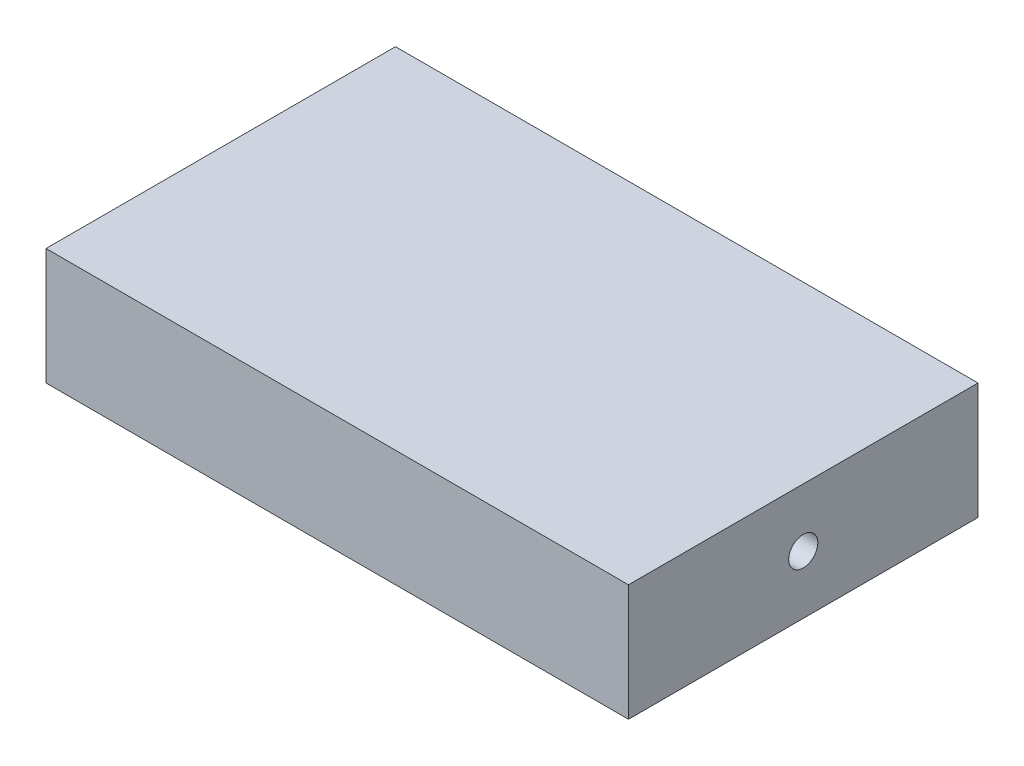
ISO-10303-21;
HEADER;
FILE_DESCRIPTION(('STEP AP214'),'2;1');
FILE_NAME('part.step','',(''),(''),'','','');
FILE_SCHEMA(('AUTOMOTIVE_DESIGN { 1 0 10303 214 1 1 1 1 }'));
ENDSEC;
DATA;
#1=APPLICATION_CONTEXT('core data for automotive mechanical design processes');
#2=APPLICATION_PROTOCOL_DEFINITION('international standard','automotive_design',2000,#1);
#3=PRODUCT_CONTEXT('',#1,'mechanical');
#4=PRODUCT('Part','Part','',(#3));
#5=PRODUCT_RELATED_PRODUCT_CATEGORY('part','',(#4));
#6=PRODUCT_DEFINITION_FORMATION('','',#4);
#7=PRODUCT_DEFINITION_CONTEXT('part definition',#1,'design');
#8=PRODUCT_DEFINITION('design','',#6,#7);
#9=PRODUCT_DEFINITION_SHAPE('','',#8);
#10=(LENGTH_UNIT() NAMED_UNIT(*) SI_UNIT(.MILLI.,.METRE.));
#11=(NAMED_UNIT(*) PLANE_ANGLE_UNIT() SI_UNIT($,.RADIAN.));
#12=(NAMED_UNIT(*) SI_UNIT($,.STERADIAN.) SOLID_ANGLE_UNIT());
#13=UNCERTAINTY_MEASURE_WITH_UNIT(LENGTH_MEASURE(1.E-05),#10,'distance_accuracy_value','');
#14=(GEOMETRIC_REPRESENTATION_CONTEXT(3) GLOBAL_UNCERTAINTY_ASSIGNED_CONTEXT((#13)) GLOBAL_UNIT_ASSIGNED_CONTEXT((#10,
#11,#12)) REPRESENTATION_CONTEXT('',''));
#15=CARTESIAN_POINT('',(0.,0.,0.));
#16=DIRECTION('',(0.,0.,1.));
#17=DIRECTION('',(1.,0.,0.));
#18=AXIS2_PLACEMENT_3D('',#15,#16,#17);
#19=CARTESIAN_POINT('',(31.75,12.7,19.05));
#20=DIRECTION('',(-1.,0.,0.));
#21=DIRECTION('',(0.,0.,1.));
#22=AXIS2_PLACEMENT_3D('',#19,#20,#21);
#23=PLANE('',#22);
#24=CARTESIAN_POINT('',(31.75,6.35,0.));
#25=DIRECTION('',(-1.,0.,0.));
#26=DIRECTION('',(0.,0.,1.));
#27=AXIS2_PLACEMENT_3D('',#24,#25,#26);
#28=CIRCLE('',#27,1.58749999999999);
#29=CARTESIAN_POINT('',(31.75,6.35,1.58749999999999));
#30=VERTEX_POINT('',#29);
#31=EDGE_CURVE('E100',#30,#30,#28,.T.);
#32=ORIENTED_EDGE('',*,*,#31,.T.);
#33=EDGE_LOOP('',(#32));
#34=FACE_BOUND('',#33,.T.);
#35=DIRECTION('',(0.,0.,-1.));
#36=VECTOR('',#35,1.);
#37=CARTESIAN_POINT('',(31.75,0.,19.05));
#38=LINE('',#37,#36);
#39=CARTESIAN_POINT('',(31.75,0.,19.05));
#40=VERTEX_POINT('',#39);
#41=CARTESIAN_POINT('',(31.75,0.,-19.05));
#42=VERTEX_POINT('',#41);
#43=EDGE_CURVE('E97',#40,#42,#38,.T.);
#44=ORIENTED_EDGE('',*,*,#43,.T.);
#45=DIRECTION('',(0.,-1.,0.));
#46=VECTOR('',#45,1.);
#47=CARTESIAN_POINT('',(31.75,12.7,-19.05));
#48=LINE('',#47,#46);
#49=CARTESIAN_POINT('',(31.75,12.7,-19.05));
#50=VERTEX_POINT('',#49);
#51=EDGE_CURVE('E11',#50,#42,#48,.T.);
#52=ORIENTED_EDGE('',*,*,#51,.F.);
#53=DIRECTION('',(0.,0.,-1.));
#54=VECTOR('',#53,1.);
#55=CARTESIAN_POINT('',(31.75,12.7,19.05));
#56=LINE('',#55,#54);
#57=CARTESIAN_POINT('',(31.75,12.7,19.05));
#58=VERTEX_POINT('',#57);
#59=EDGE_CURVE('E85',#58,#50,#56,.T.);
#60=ORIENTED_EDGE('',*,*,#59,.F.);
#61=DIRECTION('',(0.,-1.,0.));
#62=VECTOR('',#61,1.);
#63=CARTESIAN_POINT('',(31.75,12.7,19.05));
#64=LINE('',#63,#62);
#65=EDGE_CURVE('E93',#58,#40,#64,.T.);
#66=ORIENTED_EDGE('',*,*,#65,.T.);
#67=EDGE_LOOP('',(#44,#52,#60,#66));
#68=FACE_BOUND('',#67,.T.);
#69=ADVANCED_FACE('F34',(#34,#68),#23,.F.);
#70=CARTESIAN_POINT('',(-31.75,12.7,-19.05));
#71=DIRECTION('',(0.,0.,1.));
#72=DIRECTION('',(1.,0.,0.));
#73=AXIS2_PLACEMENT_3D('',#70,#71,#72);
#74=PLANE('',#73);
#75=DIRECTION('',(-1.,0.,0.));
#76=VECTOR('',#75,1.);
#77=CARTESIAN_POINT('',(-31.75,0.,-19.05));
#78=LINE('',#77,#76);
#79=CARTESIAN_POINT('',(-31.75,0.,-19.05));
#80=VERTEX_POINT('',#79);
#81=EDGE_CURVE('E89',#42,#80,#78,.T.);
#82=ORIENTED_EDGE('',*,*,#81,.T.);
#83=DIRECTION('',(0.,-1.,0.));
#84=VECTOR('',#83,1.);
#85=CARTESIAN_POINT('',(-31.75,12.7,-19.05));
#86=LINE('',#85,#84);
#87=CARTESIAN_POINT('',(-31.75,12.7,-19.05));
#88=VERTEX_POINT('',#87);
#89=EDGE_CURVE('E42',#88,#80,#86,.T.);
#90=ORIENTED_EDGE('',*,*,#89,.F.);
#91=DIRECTION('',(-1.,0.,0.));
#92=VECTOR('',#91,1.);
#93=CARTESIAN_POINT('',(-31.75,12.7,-19.05));
#94=LINE('',#93,#92);
#95=EDGE_CURVE('E80',#50,#88,#94,.T.);
#96=ORIENTED_EDGE('',*,*,#95,.F.);
#97=ORIENTED_EDGE('',*,*,#51,.T.);
#98=EDGE_LOOP('',(#82,#90,#96,#97));
#99=FACE_BOUND('',#98,.T.);
#100=ADVANCED_FACE('F88',(#99),#74,.F.);
#101=CARTESIAN_POINT('',(-31.75,12.7,19.05));
#102=DIRECTION('',(1.,0.,0.));
#103=DIRECTION('',(0.,0.,-1.));
#104=AXIS2_PLACEMENT_3D('',#101,#102,#103);
#105=PLANE('',#104);
#106=CARTESIAN_POINT('',(-31.75,6.35,0.));
#107=DIRECTION('',(-1.,0.,0.));
#108=DIRECTION('',(0.,0.,1.));
#109=AXIS2_PLACEMENT_3D('',#106,#107,#108);
#110=CIRCLE('',#109,1.58749999999999);
#111=CARTESIAN_POINT('',(-31.75,6.35,1.58749999999999));
#112=VERTEX_POINT('',#111);
#113=EDGE_CURVE('E113',#112,#112,#110,.T.);
#114=ORIENTED_EDGE('',*,*,#113,.F.);
#115=EDGE_LOOP('',(#114));
#116=FACE_BOUND('',#115,.T.);
#117=DIRECTION('',(0.,0.,1.));
#118=VECTOR('',#117,1.);
#119=CARTESIAN_POINT('',(-31.75,0.,19.05));
#120=LINE('',#119,#118);
#121=CARTESIAN_POINT('',(-31.75,0.,19.05));
#122=VERTEX_POINT('',#121);
#123=EDGE_CURVE('E67',#80,#122,#120,.T.);
#124=ORIENTED_EDGE('',*,*,#123,.T.);
#125=DIRECTION('',(0.,-1.,0.));
#126=VECTOR('',#125,1.);
#127=CARTESIAN_POINT('',(-31.75,12.7,19.05));
#128=LINE('',#127,#126);
#129=CARTESIAN_POINT('',(-31.75,12.7,19.05));
#130=VERTEX_POINT('',#129);
#131=EDGE_CURVE('E90',#130,#122,#128,.T.);
#132=ORIENTED_EDGE('',*,*,#131,.F.);
#133=DIRECTION('',(0.,0.,1.));
#134=VECTOR('',#133,1.);
#135=CARTESIAN_POINT('',(-31.75,12.7,19.05));
#136=LINE('',#135,#134);
#137=EDGE_CURVE('E83',#88,#130,#136,.T.);
#138=ORIENTED_EDGE('',*,*,#137,.F.);
#139=ORIENTED_EDGE('',*,*,#89,.T.);
#140=EDGE_LOOP('',(#124,#132,#138,#139));
#141=FACE_BOUND('',#140,.T.);
#142=ADVANCED_FACE('F91',(#116,#141),#105,.F.);
#143=CARTESIAN_POINT('',(-31.75,12.7,19.05));
#144=DIRECTION('',(0.,0.,-1.));
#145=DIRECTION('',(-1.,0.,0.));
#146=AXIS2_PLACEMENT_3D('',#143,#144,#145);
#147=PLANE('',#146);
#148=DIRECTION('',(1.,0.,0.));
#149=VECTOR('',#148,1.);
#150=CARTESIAN_POINT('',(-31.75,0.,19.05));
#151=LINE('',#150,#149);
#152=EDGE_CURVE('E73',#122,#40,#151,.T.);
#153=ORIENTED_EDGE('',*,*,#152,.T.);
#154=ORIENTED_EDGE('',*,*,#65,.F.);
#155=DIRECTION('',(1.,0.,0.));
#156=VECTOR('',#155,1.);
#157=CARTESIAN_POINT('',(-31.75,12.7,19.05));
#158=LINE('',#157,#156);
#159=EDGE_CURVE('E50',#130,#58,#158,.T.);
#160=ORIENTED_EDGE('',*,*,#159,.F.);
#161=ORIENTED_EDGE('',*,*,#131,.T.);
#162=EDGE_LOOP('',(#153,#154,#160,#161));
#163=FACE_BOUND('',#162,.T.);
#164=ADVANCED_FACE('F105',(#163),#147,.F.);
#165=CARTESIAN_POINT('',(0.,12.7,0.));
#166=DIRECTION('',(0.,-1.,0.));
#167=DIRECTION('',(0.,0.,-1.));
#168=AXIS2_PLACEMENT_3D('',#165,#166,#167);
#169=PLANE('',#168);
#170=ORIENTED_EDGE('',*,*,#59,.T.);
#171=ORIENTED_EDGE('',*,*,#95,.T.);
#172=ORIENTED_EDGE('',*,*,#137,.T.);
#173=ORIENTED_EDGE('',*,*,#159,.T.);
#174=EDGE_LOOP('',(#170,#171,#172,#173));
#175=FACE_BOUND('',#174,.T.);
#176=ADVANCED_FACE('F81',(#175),#169,.F.);
#177=CARTESIAN_POINT('',(0.,0.,0.));
#178=DIRECTION('',(0.,-1.,0.));
#179=DIRECTION('',(0.,0.,-1.));
#180=AXIS2_PLACEMENT_3D('',#177,#178,#179);
#181=PLANE('',#180);
#182=ORIENTED_EDGE('',*,*,#43,.F.);
#183=ORIENTED_EDGE('',*,*,#152,.F.);
#184=ORIENTED_EDGE('',*,*,#123,.F.);
#185=ORIENTED_EDGE('',*,*,#81,.F.);
#186=EDGE_LOOP('',(#182,#183,#184,#185));
#187=FACE_BOUND('',#186,.T.);
#188=ADVANCED_FACE('F108',(#187),#181,.T.);
#189=CARTESIAN_POINT('',(-31.75,6.35,0.));
#190=DIRECTION('',(-1.,0.,0.));
#191=DIRECTION('',(0.,0.,1.));
#192=AXIS2_PLACEMENT_3D('',#189,#190,#191);
#193=CYLINDRICAL_SURFACE('',#192,1.58749999999999);
#194=ORIENTED_EDGE('',*,*,#31,.F.);
#195=EDGE_LOOP('',(#194));
#196=FACE_BOUND('',#195,.T.);
#197=ORIENTED_EDGE('',*,*,#113,.T.);
#198=EDGE_LOOP('',(#197));
#199=FACE_BOUND('',#198,.T.);
#200=ADVANCED_FACE('F117',(#196,#199),#193,.F.);
#201=CLOSED_SHELL('',(#69,#100,#142,#164,#176,#188,#200));
#202=MANIFOLD_SOLID_BREP('B2',#201);
#203=ADVANCED_BREP_SHAPE_REPRESENTATION('',(#18,#202),#14);
#204=SHAPE_DEFINITION_REPRESENTATION(#9,#203);
ENDSEC;
END-ISO-10303-21;
